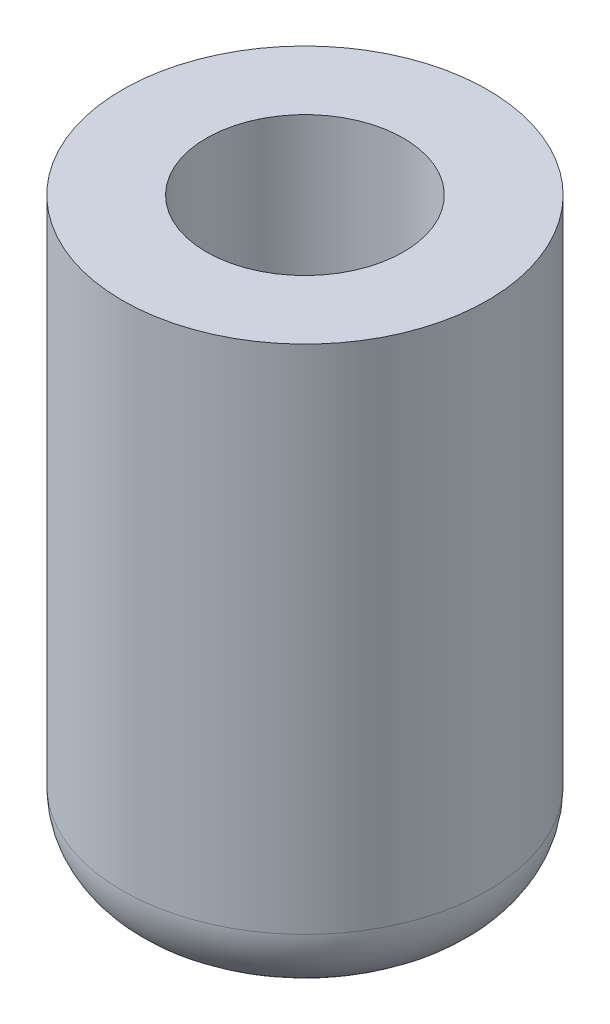
ISO-10303-21;
HEADER;
FILE_DESCRIPTION(('STEP AP214'),'2;1');
FILE_NAME('part.step','',(''),(''),'','','');
FILE_SCHEMA(('AUTOMOTIVE_DESIGN { 1 0 10303 214 1 1 1 1 }'));
ENDSEC;
DATA;
#1=APPLICATION_CONTEXT('core data for automotive mechanical design processes');
#2=APPLICATION_PROTOCOL_DEFINITION('international standard','automotive_design',2000,#1);
#3=PRODUCT_CONTEXT('',#1,'mechanical');
#4=PRODUCT('Part','Part','',(#3));
#5=PRODUCT_RELATED_PRODUCT_CATEGORY('part','',(#4));
#6=PRODUCT_DEFINITION_FORMATION('','',#4);
#7=PRODUCT_DEFINITION_CONTEXT('part definition',#1,'design');
#8=PRODUCT_DEFINITION('design','',#6,#7);
#9=PRODUCT_DEFINITION_SHAPE('','',#8);
#10=(LENGTH_UNIT() NAMED_UNIT(*) SI_UNIT(.MILLI.,.METRE.));
#11=(NAMED_UNIT(*) PLANE_ANGLE_UNIT() SI_UNIT($,.RADIAN.));
#12=(NAMED_UNIT(*) SI_UNIT($,.STERADIAN.) SOLID_ANGLE_UNIT());
#13=UNCERTAINTY_MEASURE_WITH_UNIT(LENGTH_MEASURE(1.E-05),#10,'distance_accuracy_value','');
#14=(GEOMETRIC_REPRESENTATION_CONTEXT(3) GLOBAL_UNCERTAINTY_ASSIGNED_CONTEXT((#13)) GLOBAL_UNIT_ASSIGNED_CONTEXT((#10,
#11,#12)) REPRESENTATION_CONTEXT('',''));
#15=CARTESIAN_POINT('',(0.,0.,0.));
#16=DIRECTION('',(0.,0.,1.));
#17=DIRECTION('',(1.,0.,0.));
#18=AXIS2_PLACEMENT_3D('',#15,#16,#17);
#19=CARTESIAN_POINT('',(0.,20.32,0.));
#20=DIRECTION('',(0.,-1.,0.));
#21=DIRECTION('',(0.,0.,-1.));
#22=AXIS2_PLACEMENT_3D('',#19,#20,#21);
#23=CYLINDRICAL_SURFACE('',#22,6.35);
#24=CARTESIAN_POINT('',(0.,2.54,0.));
#25=DIRECTION('',(0.,1.,0.));
#26=DIRECTION('',(0.,0.,1.));
#27=AXIS2_PLACEMENT_3D('',#24,#25,#26);
#28=CIRCLE('',#27,6.35);
#29=CARTESIAN_POINT('',(0.,2.54,6.35));
#30=VERTEX_POINT('',#29);
#31=EDGE_CURVE('E38',#30,#30,#28,.T.);
#32=ORIENTED_EDGE('',*,*,#31,.T.);
#33=EDGE_LOOP('',(#32));
#34=FACE_BOUND('',#33,.T.);
#35=CARTESIAN_POINT('',(0.,20.32,0.));
#36=DIRECTION('',(0.,1.,0.));
#37=DIRECTION('',(0.,0.,1.));
#38=AXIS2_PLACEMENT_3D('',#35,#36,#37);
#39=CIRCLE('',#38,6.35);
#40=CARTESIAN_POINT('',(0.,20.32,6.35));
#41=VERTEX_POINT('',#40);
#42=EDGE_CURVE('E42',#41,#41,#39,.T.);
#43=ORIENTED_EDGE('',*,*,#42,.F.);
#44=EDGE_LOOP('',(#43));
#45=FACE_BOUND('',#44,.T.);
#46=ADVANCED_FACE('F31',(#34,#45),#23,.T.);
#47=CARTESIAN_POINT('',(0.,20.32,0.));
#48=DIRECTION('',(0.,1.,0.));
#49=DIRECTION('',(0.,0.,1.));
#50=AXIS2_PLACEMENT_3D('',#47,#48,#49);
#51=PLANE('',#50);
#52=CARTESIAN_POINT('',(0.,20.32,0.));
#53=DIRECTION('',(0.,1.,0.));
#54=DIRECTION('',(0.,0.,1.));
#55=AXIS2_PLACEMENT_3D('',#52,#53,#54);
#56=CIRCLE('',#55,3.429);
#57=CARTESIAN_POINT('',(0.,20.32,3.429));
#58=VERTEX_POINT('',#57);
#59=EDGE_CURVE('E49',#58,#58,#56,.T.);
#60=ORIENTED_EDGE('',*,*,#59,.F.);
#61=EDGE_LOOP('',(#60));
#62=FACE_BOUND('',#61,.T.);
#63=ORIENTED_EDGE('',*,*,#42,.T.);
#64=EDGE_LOOP('',(#63));
#65=FACE_BOUND('',#64,.T.);
#66=ADVANCED_FACE('F64',(#62,#65),#51,.T.);
#67=CARTESIAN_POINT('',(0.,0.,0.));
#68=DIRECTION('',(0.,1.,0.));
#69=DIRECTION('',(0.,0.,1.));
#70=AXIS2_PLACEMENT_3D('',#67,#68,#69);
#71=PLANE('',#70);
#72=CARTESIAN_POINT('',(0.,0.,0.));
#73=DIRECTION('',(0.,1.,0.));
#74=DIRECTION('',(0.,0.,1.));
#75=AXIS2_PLACEMENT_3D('',#72,#73,#74);
#76=CIRCLE('',#75,3.81);
#77=CARTESIAN_POINT('',(0.,0.,3.81));
#78=VERTEX_POINT('',#77);
#79=EDGE_CURVE('E10',#78,#78,#76,.F.);
#80=ORIENTED_EDGE('',*,*,#79,.T.);
#81=EDGE_LOOP('',(#80));
#82=FACE_BOUND('',#81,.T.);
#83=ADVANCED_FACE('F60',(#82),#71,.F.);
#84=CARTESIAN_POINT('',(0.,2.54,0.));
#85=DIRECTION('',(0.,1.,0.));
#86=DIRECTION('',(0.,0.,1.));
#87=AXIS2_PLACEMENT_3D('',#84,#85,#86);
#88=CYLINDRICAL_SURFACE('',#87,3.429);
#89=CARTESIAN_POINT('',(0.,2.54,0.));
#90=DIRECTION('',(0.,1.,0.));
#91=DIRECTION('',(0.,0.,1.));
#92=AXIS2_PLACEMENT_3D('',#89,#90,#91);
#93=CIRCLE('',#92,3.429);
#94=CARTESIAN_POINT('',(0.,2.54,3.429));
#95=VERTEX_POINT('',#94);
#96=EDGE_CURVE('E46',#95,#95,#93,.T.);
#97=ORIENTED_EDGE('',*,*,#96,.F.);
#98=EDGE_LOOP('',(#97));
#99=FACE_BOUND('',#98,.T.);
#100=ORIENTED_EDGE('',*,*,#59,.T.);
#101=EDGE_LOOP('',(#100));
#102=FACE_BOUND('',#101,.T.);
#103=ADVANCED_FACE('F57',(#99,#102),#88,.F.);
#104=CARTESIAN_POINT('',(0.,2.54,0.));
#105=DIRECTION('',(0.,1.,0.));
#106=DIRECTION('',(0.,0.,1.));
#107=AXIS2_PLACEMENT_3D('',#104,#105,#106);
#108=PLANE('',#107);
#109=ORIENTED_EDGE('',*,*,#96,.T.);
#110=EDGE_LOOP('',(#109));
#111=FACE_BOUND('',#110,.T.);
#112=ADVANCED_FACE('F55',(#111),#108,.T.);
#113=CARTESIAN_POINT('',(0.,2.54,0.));
#114=DIRECTION('',(0.,1.,0.));
#115=DIRECTION('',(0.,0.,1.));
#116=AXIS2_PLACEMENT_3D('',#113,#114,#115);
#117=TOROIDAL_SURFACE('',#116,3.81,2.54);
#118=ORIENTED_EDGE('',*,*,#79,.F.);
#119=EDGE_LOOP('',(#118));
#120=FACE_BOUND('',#119,.T.);
#121=ORIENTED_EDGE('',*,*,#31,.F.);
#122=EDGE_LOOP('',(#121));
#123=FACE_BOUND('',#122,.T.);
#124=ADVANCED_FACE('F33',(#120,#123),#117,.T.);
#125=CLOSED_SHELL('',(#46,#66,#83,#103,#112,#124));
#126=MANIFOLD_SOLID_BREP('B2',#125);
#127=ADVANCED_BREP_SHAPE_REPRESENTATION('',(#18,#126),#14);
#128=SHAPE_DEFINITION_REPRESENTATION(#9,#127);
ENDSEC;
END-ISO-10303-21;
